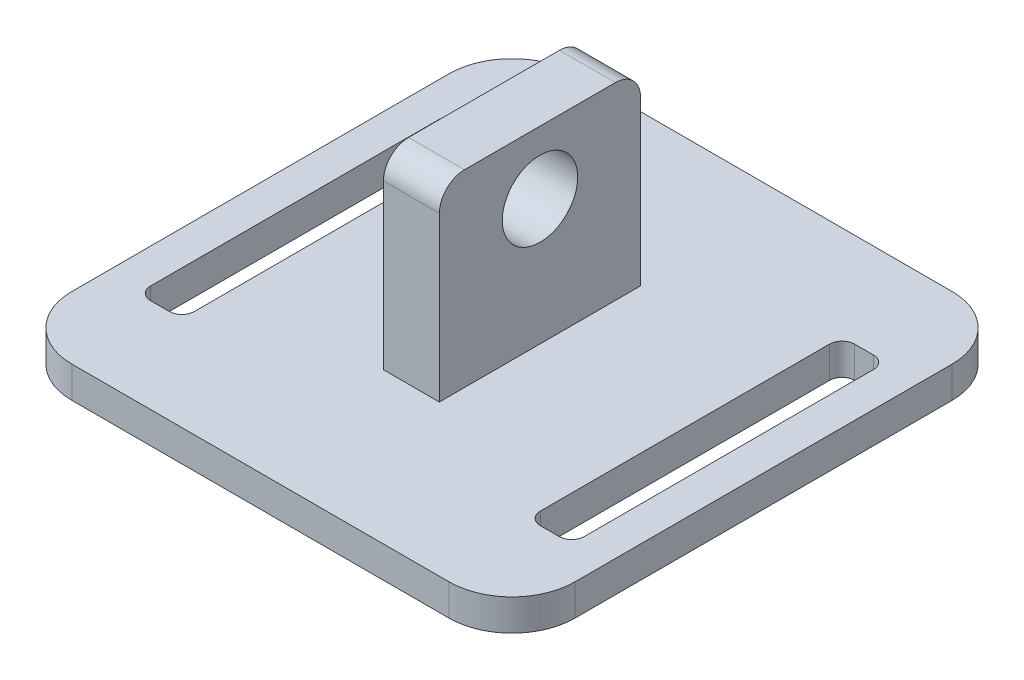
ISO-10303-21;
HEADER;
FILE_DESCRIPTION(('STEP AP214'),'2;1');
FILE_NAME('part.step','',(''),(''),'','','');
FILE_SCHEMA(('AUTOMOTIVE_DESIGN { 1 0 10303 214 1 1 1 1 }'));
ENDSEC;
DATA;
#1=APPLICATION_CONTEXT('core data for automotive mechanical design processes');
#2=APPLICATION_PROTOCOL_DEFINITION('international standard','automotive_design',2000,#1);
#3=PRODUCT_CONTEXT('',#1,'mechanical');
#4=PRODUCT('Part','Part','',(#3));
#5=PRODUCT_RELATED_PRODUCT_CATEGORY('part','',(#4));
#6=PRODUCT_DEFINITION_FORMATION('','',#4);
#7=PRODUCT_DEFINITION_CONTEXT('part definition',#1,'design');
#8=PRODUCT_DEFINITION('design','',#6,#7);
#9=PRODUCT_DEFINITION_SHAPE('','',#8);
#10=(LENGTH_UNIT() NAMED_UNIT(*) SI_UNIT(.MILLI.,.METRE.));
#11=(NAMED_UNIT(*) PLANE_ANGLE_UNIT() SI_UNIT($,.RADIAN.));
#12=(NAMED_UNIT(*) SI_UNIT($,.STERADIAN.) SOLID_ANGLE_UNIT());
#13=UNCERTAINTY_MEASURE_WITH_UNIT(LENGTH_MEASURE(1.E-05),#10,'distance_accuracy_value','');
#14=(GEOMETRIC_REPRESENTATION_CONTEXT(3) GLOBAL_UNCERTAINTY_ASSIGNED_CONTEXT((#13)) GLOBAL_UNIT_ASSIGNED_CONTEXT((#10,
#11,#12)) REPRESENTATION_CONTEXT('',''));
#15=CARTESIAN_POINT('',(0.,0.,0.));
#16=DIRECTION('',(0.,0.,1.));
#17=DIRECTION('',(1.,0.,0.));
#18=AXIS2_PLACEMENT_3D('',#15,#16,#17);
#19=CARTESIAN_POINT('',(-15.,2.5,15.));
#20=DIRECTION('',(0.,-1.,0.));
#21=DIRECTION('',(0.,0.,-1.));
#22=AXIS2_PLACEMENT_3D('',#19,#20,#21);
#23=PLANE('',#22);
#24=DIRECTION('',(0.,0.,1.));
#25=VECTOR('',#24,1.);
#26=CARTESIAN_POINT('',(13.75,2.5,-12.5));
#27=LINE('',#26,#25);
#28=CARTESIAN_POINT('',(13.75,2.5,-11.5));
#29=VERTEX_POINT('',#28);
#30=CARTESIAN_POINT('',(13.75,2.5,11.5));
#31=VERTEX_POINT('',#30);
#32=EDGE_CURVE('E270',#29,#31,#27,.T.);
#33=ORIENTED_EDGE('',*,*,#32,.F.);
#34=CARTESIAN_POINT('',(14.75,2.5,-11.5));
#35=DIRECTION('',(0.,-1.,0.));
#36=DIRECTION('',(0.,0.,-1.));
#37=AXIS2_PLACEMENT_3D('',#34,#35,#36);
#38=CIRCLE('',#37,1.);
#39=CARTESIAN_POINT('',(14.75,2.5,-12.5));
#40=VERTEX_POINT('',#39);
#41=EDGE_CURVE('E437',#29,#40,#38,.T.);
#42=ORIENTED_EDGE('',*,*,#41,.T.);
#43=DIRECTION('',(-1.,0.,0.));
#44=VECTOR('',#43,1.);
#45=CARTESIAN_POINT('',(13.75,2.5,-12.5));
#46=LINE('',#45,#44);
#47=CARTESIAN_POINT('',(16.25,2.5,-12.5));
#48=VERTEX_POINT('',#47);
#49=EDGE_CURVE('E280',#48,#40,#46,.T.);
#50=ORIENTED_EDGE('',*,*,#49,.F.);
#51=CARTESIAN_POINT('',(16.25,2.5,-11.5));
#52=DIRECTION('',(0.,-1.,0.));
#53=DIRECTION('',(0.,0.,-1.));
#54=AXIS2_PLACEMENT_3D('',#51,#52,#53);
#55=CIRCLE('',#54,1.);
#56=CARTESIAN_POINT('',(17.25,2.5,-11.5));
#57=VERTEX_POINT('',#56);
#58=EDGE_CURVE('E433',#48,#57,#55,.T.);
#59=ORIENTED_EDGE('',*,*,#58,.T.);
#60=DIRECTION('',(0.,0.,-1.));
#61=VECTOR('',#60,1.);
#62=CARTESIAN_POINT('',(17.25,2.5,-12.5));
#63=LINE('',#62,#61);
#64=CARTESIAN_POINT('',(17.25,2.5,11.5));
#65=VERTEX_POINT('',#64);
#66=EDGE_CURVE('E277',#65,#57,#63,.T.);
#67=ORIENTED_EDGE('',*,*,#66,.F.);
#68=CARTESIAN_POINT('',(16.25,2.5,11.5));
#69=DIRECTION('',(0.,-1.,0.));
#70=DIRECTION('',(0.,0.,-1.));
#71=AXIS2_PLACEMENT_3D('',#68,#69,#70);
#72=CIRCLE('',#71,1.);
#73=CARTESIAN_POINT('',(16.25,2.5,12.5));
#74=VERTEX_POINT('',#73);
#75=EDGE_CURVE('E441',#65,#74,#72,.T.);
#76=ORIENTED_EDGE('',*,*,#75,.T.);
#77=DIRECTION('',(1.,0.,0.));
#78=VECTOR('',#77,1.);
#79=CARTESIAN_POINT('',(13.75,2.5,12.5));
#80=LINE('',#79,#78);
#81=CARTESIAN_POINT('',(14.75,2.5,12.5));
#82=VERTEX_POINT('',#81);
#83=EDGE_CURVE('E273',#82,#74,#80,.T.);
#84=ORIENTED_EDGE('',*,*,#83,.F.);
#85=CARTESIAN_POINT('',(14.75,2.5,11.5));
#86=DIRECTION('',(0.,-1.,0.));
#87=DIRECTION('',(0.,0.,-1.));
#88=AXIS2_PLACEMENT_3D('',#85,#86,#87);
#89=CIRCLE('',#88,1.);
#90=EDGE_CURVE('E445',#82,#31,#89,.T.);
#91=ORIENTED_EDGE('',*,*,#90,.T.);
#92=EDGE_LOOP('',(#33,#42,#50,#59,#67,#76,#84,#91));
#93=FACE_BOUND('',#92,.T.);
#94=CARTESIAN_POINT('',(-15.,2.5,15.));
#95=DIRECTION('',(0.,1.,0.));
#96=DIRECTION('',(0.,0.,-1.));
#97=AXIS2_PLACEMENT_3D('',#94,#95,#96);
#98=CIRCLE('',#97,5.);
#99=CARTESIAN_POINT('',(-20.,2.5,15.));
#100=VERTEX_POINT('',#99);
#101=CARTESIAN_POINT('',(-15.,2.5,20.));
#102=VERTEX_POINT('',#101);
#103=EDGE_CURVE('E318',#100,#102,#98,.T.);
#104=ORIENTED_EDGE('',*,*,#103,.T.);
#105=DIRECTION('',(1.,0.,0.));
#106=VECTOR('',#105,1.);
#107=CARTESIAN_POINT('',(15.,2.5,20.));
#108=LINE('',#107,#106);
#109=CARTESIAN_POINT('',(15.,2.5,20.));
#110=VERTEX_POINT('',#109);
#111=EDGE_CURVE('E321',#102,#110,#108,.T.);
#112=ORIENTED_EDGE('',*,*,#111,.T.);
#113=CARTESIAN_POINT('',(15.,2.5,15.));
#114=DIRECTION('',(0.,1.,0.));
#115=DIRECTION('',(0.,0.,-1.));
#116=AXIS2_PLACEMENT_3D('',#113,#114,#115);
#117=CIRCLE('',#116,5.);
#118=CARTESIAN_POINT('',(20.,2.5,15.));
#119=VERTEX_POINT('',#118);
#120=EDGE_CURVE('E324',#110,#119,#117,.T.);
#121=ORIENTED_EDGE('',*,*,#120,.T.);
#122=DIRECTION('',(0.,0.,-1.));
#123=VECTOR('',#122,1.);
#124=CARTESIAN_POINT('',(20.,2.5,-15.));
#125=LINE('',#124,#123);
#126=CARTESIAN_POINT('',(20.,2.5,-15.));
#127=VERTEX_POINT('',#126);
#128=EDGE_CURVE('E326',#119,#127,#125,.T.);
#129=ORIENTED_EDGE('',*,*,#128,.T.);
#130=CARTESIAN_POINT('',(15.,2.5,-15.));
#131=DIRECTION('',(0.,1.,0.));
#132=DIRECTION('',(0.,0.,-1.));
#133=AXIS2_PLACEMENT_3D('',#130,#131,#132);
#134=CIRCLE('',#133,5.);
#135=CARTESIAN_POINT('',(15.,2.5,-20.));
#136=VERTEX_POINT('',#135);
#137=EDGE_CURVE('E328',#127,#136,#134,.T.);
#138=ORIENTED_EDGE('',*,*,#137,.T.);
#139=DIRECTION('',(-1.,0.,0.));
#140=VECTOR('',#139,1.);
#141=CARTESIAN_POINT('',(15.,2.5,-20.));
#142=LINE('',#141,#140);
#143=CARTESIAN_POINT('',(-15.,2.5,-20.));
#144=VERTEX_POINT('',#143);
#145=EDGE_CURVE('E330',#136,#144,#142,.T.);
#146=ORIENTED_EDGE('',*,*,#145,.T.);
#147=CARTESIAN_POINT('',(-15.,2.5,-15.));
#148=DIRECTION('',(0.,1.,0.));
#149=DIRECTION('',(0.,0.,1.));
#150=AXIS2_PLACEMENT_3D('',#147,#148,#149);
#151=CIRCLE('',#150,5.);
#152=CARTESIAN_POINT('',(-20.,2.5,-15.));
#153=VERTEX_POINT('',#152);
#154=EDGE_CURVE('E332',#144,#153,#151,.T.);
#155=ORIENTED_EDGE('',*,*,#154,.T.);
#156=DIRECTION('',(0.,0.,1.));
#157=VECTOR('',#156,1.);
#158=CARTESIAN_POINT('',(-20.,2.5,-15.));
#159=LINE('',#158,#157);
#160=EDGE_CURVE('E334',#153,#100,#159,.T.);
#161=ORIENTED_EDGE('',*,*,#160,.T.);
#162=EDGE_LOOP('',(#104,#112,#121,#129,#138,#146,#155,#161));
#163=FACE_BOUND('',#162,.T.);
#164=DIRECTION('',(0.,0.,1.));
#165=VECTOR('',#164,1.);
#166=CARTESIAN_POINT('',(-17.25,2.5,-12.5));
#167=LINE('',#166,#165);
#168=CARTESIAN_POINT('',(-17.25,2.5,-11.5));
#169=VERTEX_POINT('',#168);
#170=CARTESIAN_POINT('',(-17.25,2.5,11.5));
#171=VERTEX_POINT('',#170);
#172=EDGE_CURVE('E294',#169,#171,#167,.T.);
#173=ORIENTED_EDGE('',*,*,#172,.F.);
#174=CARTESIAN_POINT('',(-16.25,2.5,-11.5));
#175=DIRECTION('',(0.,-1.,0.));
#176=DIRECTION('',(0.,0.,-1.));
#177=AXIS2_PLACEMENT_3D('',#174,#175,#176);
#178=CIRCLE('',#177,1.);
#179=CARTESIAN_POINT('',(-16.25,2.5,-12.5));
#180=VERTEX_POINT('',#179);
#181=EDGE_CURVE('E409',#169,#180,#178,.T.);
#182=ORIENTED_EDGE('',*,*,#181,.T.);
#183=DIRECTION('',(-1.,0.,0.));
#184=VECTOR('',#183,1.);
#185=CARTESIAN_POINT('',(-13.75,2.5,-12.5));
#186=LINE('',#185,#184);
#187=CARTESIAN_POINT('',(-14.75,2.5,-12.5));
#188=VERTEX_POINT('',#187);
#189=EDGE_CURVE('E304',#188,#180,#186,.T.);
#190=ORIENTED_EDGE('',*,*,#189,.F.);
#191=CARTESIAN_POINT('',(-14.75,2.5,-11.5));
#192=DIRECTION('',(0.,-1.,0.));
#193=DIRECTION('',(0.,0.,-1.));
#194=AXIS2_PLACEMENT_3D('',#191,#192,#193);
#195=CIRCLE('',#194,1.);
#196=CARTESIAN_POINT('',(-13.75,2.5,-11.5));
#197=VERTEX_POINT('',#196);
#198=EDGE_CURVE('E405',#188,#197,#195,.T.);
#199=ORIENTED_EDGE('',*,*,#198,.T.);
#200=DIRECTION('',(0.,0.,-1.));
#201=VECTOR('',#200,1.);
#202=CARTESIAN_POINT('',(-13.75,2.5,-12.5));
#203=LINE('',#202,#201);
#204=CARTESIAN_POINT('',(-13.75,2.5,11.5));
#205=VERTEX_POINT('',#204);
#206=EDGE_CURVE('E301',#205,#197,#203,.T.);
#207=ORIENTED_EDGE('',*,*,#206,.F.);
#208=CARTESIAN_POINT('',(-14.75,2.5,11.5));
#209=DIRECTION('',(0.,-1.,0.));
#210=DIRECTION('',(0.,0.,-1.));
#211=AXIS2_PLACEMENT_3D('',#208,#209,#210);
#212=CIRCLE('',#211,1.);
#213=CARTESIAN_POINT('',(-14.75,2.5,12.5));
#214=VERTEX_POINT('',#213);
#215=EDGE_CURVE('E397',#205,#214,#212,.T.);
#216=ORIENTED_EDGE('',*,*,#215,.T.);
#217=DIRECTION('',(1.,0.,0.));
#218=VECTOR('',#217,1.);
#219=CARTESIAN_POINT('',(-13.75,2.5,12.5));
#220=LINE('',#219,#218);
#221=CARTESIAN_POINT('',(-16.25,2.5,12.5));
#222=VERTEX_POINT('',#221);
#223=EDGE_CURVE('E297',#222,#214,#220,.T.);
#224=ORIENTED_EDGE('',*,*,#223,.F.);
#225=CARTESIAN_POINT('',(-16.25,2.5,11.5));
#226=DIRECTION('',(0.,-1.,0.));
#227=DIRECTION('',(0.,0.,-1.));
#228=AXIS2_PLACEMENT_3D('',#225,#226,#227);
#229=CIRCLE('',#228,1.);
#230=EDGE_CURVE('E401',#222,#171,#229,.T.);
#231=ORIENTED_EDGE('',*,*,#230,.T.);
#232=EDGE_LOOP('',(#173,#182,#190,#199,#207,#216,#224,#231));
#233=FACE_BOUND('',#232,.T.);
#234=DIRECTION('',(0.,0.,1.));
#235=VECTOR('',#234,1.);
#236=CARTESIAN_POINT('',(-2.225,2.5,-8.));
#237=LINE('',#236,#235);
#238=CARTESIAN_POINT('',(-2.225,2.5,-8.));
#239=VERTEX_POINT('',#238);
#240=CARTESIAN_POINT('',(-2.225,2.5,8.));
#241=VERTEX_POINT('',#240);
#242=EDGE_CURVE('E237',#239,#241,#237,.T.);
#243=ORIENTED_EDGE('',*,*,#242,.F.);
#244=DIRECTION('',(-1.,0.,0.));
#245=VECTOR('',#244,1.);
#246=CARTESIAN_POINT('',(2.225,2.5,-8.));
#247=LINE('',#246,#245);
#248=CARTESIAN_POINT('',(2.225,2.5,-8.));
#249=VERTEX_POINT('',#248);
#250=EDGE_CURVE('E248',#249,#239,#247,.T.);
#251=ORIENTED_EDGE('',*,*,#250,.F.);
#252=DIRECTION('',(0.,0.,-1.));
#253=VECTOR('',#252,1.);
#254=CARTESIAN_POINT('',(2.225,2.5,-8.));
#255=LINE('',#254,#253);
#256=CARTESIAN_POINT('',(2.225,2.5,8.));
#257=VERTEX_POINT('',#256);
#258=EDGE_CURVE('E257',#257,#249,#255,.T.);
#259=ORIENTED_EDGE('',*,*,#258,.F.);
#260=DIRECTION('',(1.,0.,0.));
#261=VECTOR('',#260,1.);
#262=CARTESIAN_POINT('',(2.225,2.5,8.));
#263=LINE('',#262,#261);
#264=EDGE_CURVE('E251',#241,#257,#263,.T.);
#265=ORIENTED_EDGE('',*,*,#264,.F.);
#266=EDGE_LOOP('',(#243,#251,#259,#265));
#267=FACE_BOUND('',#266,.T.);
#268=ADVANCED_FACE('F39',(#93,#163,#233,#267),#23,.F.);
#269=CARTESIAN_POINT('',(-15.,0.,15.));
#270=DIRECTION('',(0.,-1.,0.));
#271=DIRECTION('',(0.,0.,-1.));
#272=AXIS2_PLACEMENT_3D('',#269,#270,#271);
#273=PLANE('',#272);
#274=CARTESIAN_POINT('',(-15.,0.,15.));
#275=DIRECTION('',(0.,1.,0.));
#276=DIRECTION('',(0.,0.,-1.));
#277=AXIS2_PLACEMENT_3D('',#274,#275,#276);
#278=CIRCLE('',#277,5.);
#279=CARTESIAN_POINT('',(-20.,0.,15.));
#280=VERTEX_POINT('',#279);
#281=CARTESIAN_POINT('',(-15.,0.,20.));
#282=VERTEX_POINT('',#281);
#283=EDGE_CURVE('E307',#280,#282,#278,.T.);
#284=ORIENTED_EDGE('',*,*,#283,.F.);
#285=DIRECTION('',(0.,0.,1.));
#286=VECTOR('',#285,1.);
#287=CARTESIAN_POINT('',(-20.,0.,-15.));
#288=LINE('',#287,#286);
#289=CARTESIAN_POINT('',(-20.,0.,-15.));
#290=VERTEX_POINT('',#289);
#291=EDGE_CURVE('E322',#290,#280,#288,.T.);
#292=ORIENTED_EDGE('',*,*,#291,.F.);
#293=CARTESIAN_POINT('',(-15.,0.,-15.));
#294=DIRECTION('',(0.,1.,0.));
#295=DIRECTION('',(0.,0.,1.));
#296=AXIS2_PLACEMENT_3D('',#293,#294,#295);
#297=CIRCLE('',#296,5.);
#298=CARTESIAN_POINT('',(-15.,0.,-20.));
#299=VERTEX_POINT('',#298);
#300=EDGE_CURVE('E349',#299,#290,#297,.T.);
#301=ORIENTED_EDGE('',*,*,#300,.F.);
#302=DIRECTION('',(-1.,0.,0.));
#303=VECTOR('',#302,1.);
#304=CARTESIAN_POINT('',(15.,0.,-20.));
#305=LINE('',#304,#303);
#306=CARTESIAN_POINT('',(15.,0.,-20.));
#307=VERTEX_POINT('',#306);
#308=EDGE_CURVE('E347',#307,#299,#305,.T.);
#309=ORIENTED_EDGE('',*,*,#308,.F.);
#310=CARTESIAN_POINT('',(15.,0.,-15.));
#311=DIRECTION('',(0.,1.,0.));
#312=DIRECTION('',(0.,0.,-1.));
#313=AXIS2_PLACEMENT_3D('',#310,#311,#312);
#314=CIRCLE('',#313,5.);
#315=CARTESIAN_POINT('',(20.,0.,-15.));
#316=VERTEX_POINT('',#315);
#317=EDGE_CURVE('E345',#316,#307,#314,.T.);
#318=ORIENTED_EDGE('',*,*,#317,.F.);
#319=DIRECTION('',(0.,0.,-1.));
#320=VECTOR('',#319,1.);
#321=CARTESIAN_POINT('',(20.,0.,-15.));
#322=LINE('',#321,#320);
#323=CARTESIAN_POINT('',(20.,0.,15.));
#324=VERTEX_POINT('',#323);
#325=EDGE_CURVE('E343',#324,#316,#322,.T.);
#326=ORIENTED_EDGE('',*,*,#325,.F.);
#327=CARTESIAN_POINT('',(15.,0.,15.));
#328=DIRECTION('',(0.,1.,0.));
#329=DIRECTION('',(0.,0.,-1.));
#330=AXIS2_PLACEMENT_3D('',#327,#328,#329);
#331=CIRCLE('',#330,5.);
#332=CARTESIAN_POINT('',(15.,0.,20.));
#333=VERTEX_POINT('',#332);
#334=EDGE_CURVE('E341',#333,#324,#331,.T.);
#335=ORIENTED_EDGE('',*,*,#334,.F.);
#336=DIRECTION('',(1.,0.,0.));
#337=VECTOR('',#336,1.);
#338=CARTESIAN_POINT('',(15.,0.,20.));
#339=LINE('',#338,#337);
#340=EDGE_CURVE('E339',#282,#333,#339,.T.);
#341=ORIENTED_EDGE('',*,*,#340,.F.);
#342=EDGE_LOOP('',(#284,#292,#301,#309,#318,#326,#335,#341));
#343=FACE_BOUND('',#342,.T.);
#344=DIRECTION('',(0.,0.,-1.));
#345=VECTOR('',#344,1.);
#346=CARTESIAN_POINT('',(-13.75,0.,-12.5));
#347=LINE('',#346,#345);
#348=CARTESIAN_POINT('',(-13.75,0.,11.5));
#349=VERTEX_POINT('',#348);
#350=CARTESIAN_POINT('',(-13.75,0.,-11.5));
#351=VERTEX_POINT('',#350);
#352=EDGE_CURVE('E313',#349,#351,#347,.T.);
#353=ORIENTED_EDGE('',*,*,#352,.T.);
#354=CARTESIAN_POINT('',(-14.75,0.,-11.5));
#355=DIRECTION('',(0.,-1.,0.));
#356=DIRECTION('',(0.,0.,-1.));
#357=AXIS2_PLACEMENT_3D('',#354,#355,#356);
#358=CIRCLE('',#357,1.);
#359=CARTESIAN_POINT('',(-14.75,0.,-12.5));
#360=VERTEX_POINT('',#359);
#361=EDGE_CURVE('E403',#351,#360,#358,.F.);
#362=ORIENTED_EDGE('',*,*,#361,.T.);
#363=DIRECTION('',(-1.,0.,0.));
#364=VECTOR('',#363,1.);
#365=CARTESIAN_POINT('',(-13.75,0.,-12.5));
#366=LINE('',#365,#364);
#367=CARTESIAN_POINT('',(-16.25,0.,-12.5));
#368=VERTEX_POINT('',#367);
#369=EDGE_CURVE('E298',#360,#368,#366,.T.);
#370=ORIENTED_EDGE('',*,*,#369,.T.);
#371=CARTESIAN_POINT('',(-16.25,0.,-11.5));
#372=DIRECTION('',(0.,-1.,0.));
#373=DIRECTION('',(0.,0.,-1.));
#374=AXIS2_PLACEMENT_3D('',#371,#372,#373);
#375=CIRCLE('',#374,1.);
#376=CARTESIAN_POINT('',(-17.25,0.,-11.5));
#377=VERTEX_POINT('',#376);
#378=EDGE_CURVE('E407',#368,#377,#375,.F.);
#379=ORIENTED_EDGE('',*,*,#378,.T.);
#380=DIRECTION('',(0.,0.,1.));
#381=VECTOR('',#380,1.);
#382=CARTESIAN_POINT('',(-17.25,0.,-12.5));
#383=LINE('',#382,#381);
#384=CARTESIAN_POINT('',(-17.25,0.,11.5));
#385=VERTEX_POINT('',#384);
#386=EDGE_CURVE('E283',#377,#385,#383,.T.);
#387=ORIENTED_EDGE('',*,*,#386,.T.);
#388=CARTESIAN_POINT('',(-16.25,0.,11.5));
#389=DIRECTION('',(0.,-1.,0.));
#390=DIRECTION('',(0.,0.,-1.));
#391=AXIS2_PLACEMENT_3D('',#388,#389,#390);
#392=CIRCLE('',#391,1.);
#393=CARTESIAN_POINT('',(-16.25,0.,12.5));
#394=VERTEX_POINT('',#393);
#395=EDGE_CURVE('E399',#385,#394,#392,.F.);
#396=ORIENTED_EDGE('',*,*,#395,.T.);
#397=DIRECTION('',(1.,0.,0.));
#398=VECTOR('',#397,1.);
#399=CARTESIAN_POINT('',(-13.75,0.,12.5));
#400=LINE('',#399,#398);
#401=CARTESIAN_POINT('',(-14.75,0.,12.5));
#402=VERTEX_POINT('',#401);
#403=EDGE_CURVE('E310',#394,#402,#400,.T.);
#404=ORIENTED_EDGE('',*,*,#403,.T.);
#405=CARTESIAN_POINT('',(-14.75,0.,11.5));
#406=DIRECTION('',(0.,-1.,0.));
#407=DIRECTION('',(0.,0.,-1.));
#408=AXIS2_PLACEMENT_3D('',#405,#406,#407);
#409=CIRCLE('',#408,1.);
#410=EDGE_CURVE('E395',#402,#349,#409,.F.);
#411=ORIENTED_EDGE('',*,*,#410,.T.);
#412=EDGE_LOOP('',(#353,#362,#370,#379,#387,#396,#404,#411));
#413=FACE_BOUND('',#412,.T.);
#414=DIRECTION('',(0.,0.,-1.));
#415=VECTOR('',#414,1.);
#416=CARTESIAN_POINT('',(17.25,0.,-12.5));
#417=LINE('',#416,#415);
#418=CARTESIAN_POINT('',(17.25,0.,11.5));
#419=VERTEX_POINT('',#418);
#420=CARTESIAN_POINT('',(17.25,0.,-11.5));
#421=VERTEX_POINT('',#420);
#422=EDGE_CURVE('E289',#419,#421,#417,.T.);
#423=ORIENTED_EDGE('',*,*,#422,.T.);
#424=CARTESIAN_POINT('',(16.25,0.,-11.5));
#425=DIRECTION('',(0.,-1.,0.));
#426=DIRECTION('',(0.,0.,-1.));
#427=AXIS2_PLACEMENT_3D('',#424,#425,#426);
#428=CIRCLE('',#427,1.);
#429=CARTESIAN_POINT('',(16.25,0.,-12.5));
#430=VERTEX_POINT('',#429);
#431=EDGE_CURVE('E431',#421,#430,#428,.F.);
#432=ORIENTED_EDGE('',*,*,#431,.T.);
#433=DIRECTION('',(-1.,0.,0.));
#434=VECTOR('',#433,1.);
#435=CARTESIAN_POINT('',(13.75,0.,-12.5));
#436=LINE('',#435,#434);
#437=CARTESIAN_POINT('',(14.75,0.,-12.5));
#438=VERTEX_POINT('',#437);
#439=EDGE_CURVE('E274',#430,#438,#436,.T.);
#440=ORIENTED_EDGE('',*,*,#439,.T.);
#441=CARTESIAN_POINT('',(14.75,0.,-11.5));
#442=DIRECTION('',(0.,-1.,0.));
#443=DIRECTION('',(0.,0.,-1.));
#444=AXIS2_PLACEMENT_3D('',#441,#442,#443);
#445=CIRCLE('',#444,1.);
#446=CARTESIAN_POINT('',(13.75,0.,-11.5));
#447=VERTEX_POINT('',#446);
#448=EDGE_CURVE('E435',#438,#447,#445,.F.);
#449=ORIENTED_EDGE('',*,*,#448,.T.);
#450=DIRECTION('',(0.,0.,1.));
#451=VECTOR('',#450,1.);
#452=CARTESIAN_POINT('',(13.75,0.,-12.5));
#453=LINE('',#452,#451);
#454=CARTESIAN_POINT('',(13.75,0.,11.5));
#455=VERTEX_POINT('',#454);
#456=EDGE_CURVE('E269',#447,#455,#453,.T.);
#457=ORIENTED_EDGE('',*,*,#456,.T.);
#458=CARTESIAN_POINT('',(14.75,0.,11.5));
#459=DIRECTION('',(0.,-1.,0.));
#460=DIRECTION('',(0.,0.,-1.));
#461=AXIS2_PLACEMENT_3D('',#458,#459,#460);
#462=CIRCLE('',#461,1.);
#463=CARTESIAN_POINT('',(14.75,0.,12.5));
#464=VERTEX_POINT('',#463);
#465=EDGE_CURVE('E443',#455,#464,#462,.F.);
#466=ORIENTED_EDGE('',*,*,#465,.T.);
#467=DIRECTION('',(1.,0.,0.));
#468=VECTOR('',#467,1.);
#469=CARTESIAN_POINT('',(13.75,0.,12.5));
#470=LINE('',#469,#468);
#471=CARTESIAN_POINT('',(16.25,0.,12.5));
#472=VERTEX_POINT('',#471);
#473=EDGE_CURVE('E286',#464,#472,#470,.T.);
#474=ORIENTED_EDGE('',*,*,#473,.T.);
#475=CARTESIAN_POINT('',(16.25,0.,11.5));
#476=DIRECTION('',(0.,-1.,0.));
#477=DIRECTION('',(0.,0.,-1.));
#478=AXIS2_PLACEMENT_3D('',#475,#476,#477);
#479=CIRCLE('',#478,1.);
#480=EDGE_CURVE('E439',#472,#419,#479,.F.);
#481=ORIENTED_EDGE('',*,*,#480,.T.);
#482=EDGE_LOOP('',(#423,#432,#440,#449,#457,#466,#474,#481));
#483=FACE_BOUND('',#482,.T.);
#484=ADVANCED_FACE('F491',(#343,#413,#483),#273,.T.);
#485=CARTESIAN_POINT('',(-15.,2.5,15.));
#486=DIRECTION('',(0.,-1.,0.));
#487=DIRECTION('',(0.,0.,-1.));
#488=AXIS2_PLACEMENT_3D('',#485,#486,#487);
#489=CYLINDRICAL_SURFACE('',#488,5.);
#490=ORIENTED_EDGE('',*,*,#283,.T.);
#491=DIRECTION('',(0.,-1.,0.));
#492=VECTOR('',#491,1.);
#493=CARTESIAN_POINT('',(-15.,2.5,20.));
#494=LINE('',#493,#492);
#495=EDGE_CURVE('E372',#102,#282,#494,.T.);
#496=ORIENTED_EDGE('',*,*,#495,.F.);
#497=ORIENTED_EDGE('',*,*,#103,.F.);
#498=DIRECTION('',(0.,-1.,0.));
#499=VECTOR('',#498,1.);
#500=CARTESIAN_POINT('',(-20.,2.5,15.));
#501=LINE('',#500,#499);
#502=EDGE_CURVE('E336',#100,#280,#501,.T.);
#503=ORIENTED_EDGE('',*,*,#502,.T.);
#504=EDGE_LOOP('',(#490,#496,#497,#503));
#505=FACE_BOUND('',#504,.T.);
#506=ADVANCED_FACE('F498',(#505),#489,.T.);
#507=CARTESIAN_POINT('',(15.,2.5,20.));
#508=DIRECTION('',(0.,0.,-1.));
#509=DIRECTION('',(-1.,0.,0.));
#510=AXIS2_PLACEMENT_3D('',#507,#508,#509);
#511=PLANE('',#510);
#512=ORIENTED_EDGE('',*,*,#340,.T.);
#513=DIRECTION('',(0.,-1.,0.));
#514=VECTOR('',#513,1.);
#515=CARTESIAN_POINT('',(15.,2.5,20.));
#516=LINE('',#515,#514);
#517=EDGE_CURVE('E369',#110,#333,#516,.T.);
#518=ORIENTED_EDGE('',*,*,#517,.F.);
#519=ORIENTED_EDGE('',*,*,#111,.F.);
#520=ORIENTED_EDGE('',*,*,#495,.T.);
#521=EDGE_LOOP('',(#512,#518,#519,#520));
#522=FACE_BOUND('',#521,.T.);
#523=ADVANCED_FACE('F530',(#522),#511,.F.);
#524=CARTESIAN_POINT('',(15.,2.5,15.));
#525=DIRECTION('',(0.,-1.,0.));
#526=DIRECTION('',(0.,0.,-1.));
#527=AXIS2_PLACEMENT_3D('',#524,#525,#526);
#528=CYLINDRICAL_SURFACE('',#527,5.);
#529=ORIENTED_EDGE('',*,*,#334,.T.);
#530=DIRECTION('',(0.,-1.,0.));
#531=VECTOR('',#530,1.);
#532=CARTESIAN_POINT('',(20.,2.5,15.));
#533=LINE('',#532,#531);
#534=EDGE_CURVE('E366',#119,#324,#533,.T.);
#535=ORIENTED_EDGE('',*,*,#534,.F.);
#536=ORIENTED_EDGE('',*,*,#120,.F.);
#537=ORIENTED_EDGE('',*,*,#517,.T.);
#538=EDGE_LOOP('',(#529,#535,#536,#537));
#539=FACE_BOUND('',#538,.T.);
#540=ADVANCED_FACE('F526',(#539),#528,.T.);
#541=CARTESIAN_POINT('',(20.,2.5,-15.));
#542=DIRECTION('',(-1.,0.,0.));
#543=DIRECTION('',(0.,0.,1.));
#544=AXIS2_PLACEMENT_3D('',#541,#542,#543);
#545=PLANE('',#544);
#546=ORIENTED_EDGE('',*,*,#325,.T.);
#547=DIRECTION('',(0.,-1.,0.));
#548=VECTOR('',#547,1.);
#549=CARTESIAN_POINT('',(20.,2.5,-15.));
#550=LINE('',#549,#548);
#551=EDGE_CURVE('E363',#127,#316,#550,.T.);
#552=ORIENTED_EDGE('',*,*,#551,.F.);
#553=ORIENTED_EDGE('',*,*,#128,.F.);
#554=ORIENTED_EDGE('',*,*,#534,.T.);
#555=EDGE_LOOP('',(#546,#552,#553,#554));
#556=FACE_BOUND('',#555,.T.);
#557=ADVANCED_FACE('F522',(#556),#545,.F.);
#558=CARTESIAN_POINT('',(15.,2.5,-15.));
#559=DIRECTION('',(0.,-1.,0.));
#560=DIRECTION('',(0.,0.,-1.));
#561=AXIS2_PLACEMENT_3D('',#558,#559,#560);
#562=CYLINDRICAL_SURFACE('',#561,5.);
#563=ORIENTED_EDGE('',*,*,#317,.T.);
#564=DIRECTION('',(0.,-1.,0.));
#565=VECTOR('',#564,1.);
#566=CARTESIAN_POINT('',(15.,2.5,-20.));
#567=LINE('',#566,#565);
#568=EDGE_CURVE('E360',#136,#307,#567,.T.);
#569=ORIENTED_EDGE('',*,*,#568,.F.);
#570=ORIENTED_EDGE('',*,*,#137,.F.);
#571=ORIENTED_EDGE('',*,*,#551,.T.);
#572=EDGE_LOOP('',(#563,#569,#570,#571));
#573=FACE_BOUND('',#572,.T.);
#574=ADVANCED_FACE('F518',(#573),#562,.T.);
#575=CARTESIAN_POINT('',(15.,2.5,-20.));
#576=DIRECTION('',(0.,0.,1.));
#577=DIRECTION('',(1.,0.,0.));
#578=AXIS2_PLACEMENT_3D('',#575,#576,#577);
#579=PLANE('',#578);
#580=ORIENTED_EDGE('',*,*,#308,.T.);
#581=DIRECTION('',(0.,-1.,0.));
#582=VECTOR('',#581,1.);
#583=CARTESIAN_POINT('',(-15.,2.5,-20.));
#584=LINE('',#583,#582);
#585=EDGE_CURVE('E357',#144,#299,#584,.T.);
#586=ORIENTED_EDGE('',*,*,#585,.F.);
#587=ORIENTED_EDGE('',*,*,#145,.F.);
#588=ORIENTED_EDGE('',*,*,#568,.T.);
#589=EDGE_LOOP('',(#580,#586,#587,#588));
#590=FACE_BOUND('',#589,.T.);
#591=ADVANCED_FACE('F514',(#590),#579,.F.);
#592=CARTESIAN_POINT('',(-15.,2.5,-15.));
#593=DIRECTION('',(0.,-1.,0.));
#594=DIRECTION('',(0.,0.,-1.));
#595=AXIS2_PLACEMENT_3D('',#592,#593,#594);
#596=CYLINDRICAL_SURFACE('',#595,5.);
#597=ORIENTED_EDGE('',*,*,#300,.T.);
#598=DIRECTION('',(0.,-1.,0.));
#599=VECTOR('',#598,1.);
#600=CARTESIAN_POINT('',(-20.,2.5,-15.));
#601=LINE('',#600,#599);
#602=EDGE_CURVE('E354',#153,#290,#601,.T.);
#603=ORIENTED_EDGE('',*,*,#602,.F.);
#604=ORIENTED_EDGE('',*,*,#154,.F.);
#605=ORIENTED_EDGE('',*,*,#585,.T.);
#606=EDGE_LOOP('',(#597,#603,#604,#605));
#607=FACE_BOUND('',#606,.T.);
#608=ADVANCED_FACE('F510',(#607),#596,.T.);
#609=CARTESIAN_POINT('',(-20.,2.5,-15.));
#610=DIRECTION('',(1.,0.,0.));
#611=DIRECTION('',(0.,0.,-1.));
#612=AXIS2_PLACEMENT_3D('',#609,#610,#611);
#613=PLANE('',#612);
#614=ORIENTED_EDGE('',*,*,#291,.T.);
#615=ORIENTED_EDGE('',*,*,#502,.F.);
#616=ORIENTED_EDGE('',*,*,#160,.F.);
#617=ORIENTED_EDGE('',*,*,#602,.T.);
#618=EDGE_LOOP('',(#614,#615,#616,#617));
#619=FACE_BOUND('',#618,.T.);
#620=ADVANCED_FACE('F507',(#619),#613,.F.);
#621=CARTESIAN_POINT('',(-17.25,2.5,-12.5));
#622=DIRECTION('',(1.,0.,0.));
#623=DIRECTION('',(0.,0.,-1.));
#624=AXIS2_PLACEMENT_3D('',#621,#622,#623);
#625=PLANE('',#624);
#626=ORIENTED_EDGE('',*,*,#172,.T.);
#627=DIRECTION('',(0.,-1.,0.));
#628=VECTOR('',#627,1.);
#629=CARTESIAN_POINT('',(-17.25,0.,11.5));
#630=LINE('',#629,#628);
#631=EDGE_CURVE('E387',#171,#385,#630,.T.);
#632=ORIENTED_EDGE('',*,*,#631,.T.);
#633=ORIENTED_EDGE('',*,*,#386,.F.);
#634=DIRECTION('',(0.,-1.,0.));
#635=VECTOR('',#634,1.);
#636=CARTESIAN_POINT('',(-17.25,2.5,-11.5));
#637=LINE('',#636,#635);
#638=EDGE_CURVE('E385',#377,#169,#637,.F.);
#639=ORIENTED_EDGE('',*,*,#638,.T.);
#640=EDGE_LOOP('',(#626,#632,#633,#639));
#641=FACE_BOUND('',#640,.T.);
#642=ADVANCED_FACE('F504',(#641),#625,.T.);
#643=CARTESIAN_POINT('',(-13.75,2.5,12.5));
#644=DIRECTION('',(0.,0.,-1.));
#645=DIRECTION('',(-1.,0.,0.));
#646=AXIS2_PLACEMENT_3D('',#643,#644,#645);
#647=PLANE('',#646);
#648=ORIENTED_EDGE('',*,*,#223,.T.);
#649=DIRECTION('',(0.,-1.,0.));
#650=VECTOR('',#649,1.);
#651=CARTESIAN_POINT('',(-14.75,0.,12.5));
#652=LINE('',#651,#650);
#653=EDGE_CURVE('E377',#214,#402,#652,.T.);
#654=ORIENTED_EDGE('',*,*,#653,.T.);
#655=ORIENTED_EDGE('',*,*,#403,.F.);
#656=DIRECTION('',(0.,-1.,0.));
#657=VECTOR('',#656,1.);
#658=CARTESIAN_POINT('',(-16.25,2.5,12.5));
#659=LINE('',#658,#657);
#660=EDGE_CURVE('E375',#394,#222,#659,.F.);
#661=ORIENTED_EDGE('',*,*,#660,.T.);
#662=EDGE_LOOP('',(#648,#654,#655,#661));
#663=FACE_BOUND('',#662,.T.);
#664=ADVANCED_FACE('F615',(#663),#647,.T.);
#665=CARTESIAN_POINT('',(-13.75,2.5,-12.5));
#666=DIRECTION('',(-1.,0.,0.));
#667=DIRECTION('',(0.,0.,1.));
#668=AXIS2_PLACEMENT_3D('',#665,#666,#667);
#669=PLANE('',#668);
#670=ORIENTED_EDGE('',*,*,#352,.F.);
#671=DIRECTION('',(0.,-1.,0.));
#672=VECTOR('',#671,1.);
#673=CARTESIAN_POINT('',(-13.75,2.5,11.5));
#674=LINE('',#673,#672);
#675=EDGE_CURVE('E383',#349,#205,#674,.F.);
#676=ORIENTED_EDGE('',*,*,#675,.T.);
#677=ORIENTED_EDGE('',*,*,#206,.T.);
#678=DIRECTION('',(0.,-1.,0.));
#679=VECTOR('',#678,1.);
#680=CARTESIAN_POINT('',(-13.75,0.,-11.5));
#681=LINE('',#680,#679);
#682=EDGE_CURVE('E380',#197,#351,#681,.T.);
#683=ORIENTED_EDGE('',*,*,#682,.T.);
#684=EDGE_LOOP('',(#670,#676,#677,#683));
#685=FACE_BOUND('',#684,.T.);
#686=ADVANCED_FACE('F612',(#685),#669,.T.);
#687=CARTESIAN_POINT('',(-13.75,2.5,-12.5));
#688=DIRECTION('',(0.,0.,1.));
#689=DIRECTION('',(1.,0.,0.));
#690=AXIS2_PLACEMENT_3D('',#687,#688,#689);
#691=PLANE('',#690);
#692=ORIENTED_EDGE('',*,*,#369,.F.);
#693=DIRECTION('',(0.,-1.,0.));
#694=VECTOR('',#693,1.);
#695=CARTESIAN_POINT('',(-14.75,2.5,-12.5));
#696=LINE('',#695,#694);
#697=EDGE_CURVE('E393',#360,#188,#696,.F.);
#698=ORIENTED_EDGE('',*,*,#697,.T.);
#699=ORIENTED_EDGE('',*,*,#189,.T.);
#700=DIRECTION('',(0.,-1.,0.));
#701=VECTOR('',#700,1.);
#702=CARTESIAN_POINT('',(-16.25,0.,-12.5));
#703=LINE('',#702,#701);
#704=EDGE_CURVE('E390',#180,#368,#703,.T.);
#705=ORIENTED_EDGE('',*,*,#704,.T.);
#706=EDGE_LOOP('',(#692,#698,#699,#705));
#707=FACE_BOUND('',#706,.T.);
#708=ADVANCED_FACE('F606',(#707),#691,.T.);
#709=CARTESIAN_POINT('',(13.75,2.5,-12.5));
#710=DIRECTION('',(1.,0.,0.));
#711=DIRECTION('',(0.,0.,-1.));
#712=AXIS2_PLACEMENT_3D('',#709,#710,#711);
#713=PLANE('',#712);
#714=ORIENTED_EDGE('',*,*,#456,.F.);
#715=DIRECTION('',(0.,-1.,0.));
#716=VECTOR('',#715,1.);
#717=CARTESIAN_POINT('',(13.75,2.5,-11.5));
#718=LINE('',#717,#716);
#719=EDGE_CURVE('E424',#447,#29,#718,.F.);
#720=ORIENTED_EDGE('',*,*,#719,.T.);
#721=ORIENTED_EDGE('',*,*,#32,.T.);
#722=DIRECTION('',(0.,-1.,0.));
#723=VECTOR('',#722,1.);
#724=CARTESIAN_POINT('',(13.75,0.,11.5));
#725=LINE('',#724,#723);
#726=EDGE_CURVE('E421',#31,#455,#725,.T.);
#727=ORIENTED_EDGE('',*,*,#726,.T.);
#728=EDGE_LOOP('',(#714,#720,#721,#727));
#729=FACE_BOUND('',#728,.T.);
#730=ADVANCED_FACE('F579',(#729),#713,.T.);
#731=CARTESIAN_POINT('',(13.75,2.5,12.5));
#732=DIRECTION('',(0.,0.,-1.));
#733=DIRECTION('',(-1.,0.,0.));
#734=AXIS2_PLACEMENT_3D('',#731,#732,#733);
#735=PLANE('',#734);
#736=ORIENTED_EDGE('',*,*,#83,.T.);
#737=DIRECTION('',(0.,-1.,0.));
#738=VECTOR('',#737,1.);
#739=CARTESIAN_POINT('',(16.25,0.,12.5));
#740=LINE('',#739,#738);
#741=EDGE_CURVE('E428',#74,#472,#740,.T.);
#742=ORIENTED_EDGE('',*,*,#741,.T.);
#743=ORIENTED_EDGE('',*,*,#473,.F.);
#744=DIRECTION('',(0.,-1.,0.));
#745=VECTOR('',#744,1.);
#746=CARTESIAN_POINT('',(14.75,2.5,12.5));
#747=LINE('',#746,#745);
#748=EDGE_CURVE('E426',#464,#82,#747,.F.);
#749=ORIENTED_EDGE('',*,*,#748,.T.);
#750=EDGE_LOOP('',(#736,#742,#743,#749));
#751=FACE_BOUND('',#750,.T.);
#752=ADVANCED_FACE('F596',(#751),#735,.T.);
#753=CARTESIAN_POINT('',(17.25,2.5,-12.5));
#754=DIRECTION('',(-1.,0.,0.));
#755=DIRECTION('',(0.,0.,1.));
#756=AXIS2_PLACEMENT_3D('',#753,#754,#755);
#757=PLANE('',#756);
#758=ORIENTED_EDGE('',*,*,#66,.T.);
#759=DIRECTION('',(0.,-1.,0.));
#760=VECTOR('',#759,1.);
#761=CARTESIAN_POINT('',(17.25,0.,-11.5));
#762=LINE('',#761,#760);
#763=EDGE_CURVE('E413',#57,#421,#762,.T.);
#764=ORIENTED_EDGE('',*,*,#763,.T.);
#765=ORIENTED_EDGE('',*,*,#422,.F.);
#766=DIRECTION('',(0.,-1.,0.));
#767=VECTOR('',#766,1.);
#768=CARTESIAN_POINT('',(17.25,2.5,11.5));
#769=LINE('',#768,#767);
#770=EDGE_CURVE('E411',#419,#65,#769,.F.);
#771=ORIENTED_EDGE('',*,*,#770,.T.);
#772=EDGE_LOOP('',(#758,#764,#765,#771));
#773=FACE_BOUND('',#772,.T.);
#774=ADVANCED_FACE('F591',(#773),#757,.T.);
#775=CARTESIAN_POINT('',(13.75,2.5,-12.5));
#776=DIRECTION('',(0.,0.,1.));
#777=DIRECTION('',(1.,0.,0.));
#778=AXIS2_PLACEMENT_3D('',#775,#776,#777);
#779=PLANE('',#778);
#780=ORIENTED_EDGE('',*,*,#439,.F.);
#781=DIRECTION('',(0.,-1.,0.));
#782=VECTOR('',#781,1.);
#783=CARTESIAN_POINT('',(16.25,2.5,-12.5));
#784=LINE('',#783,#782);
#785=EDGE_CURVE('E419',#430,#48,#784,.F.);
#786=ORIENTED_EDGE('',*,*,#785,.T.);
#787=ORIENTED_EDGE('',*,*,#49,.T.);
#788=DIRECTION('',(0.,-1.,0.));
#789=VECTOR('',#788,1.);
#790=CARTESIAN_POINT('',(14.75,0.,-12.5));
#791=LINE('',#790,#789);
#792=EDGE_CURVE('E416',#40,#438,#791,.T.);
#793=ORIENTED_EDGE('',*,*,#792,.T.);
#794=EDGE_LOOP('',(#780,#786,#787,#793));
#795=FACE_BOUND('',#794,.T.);
#796=ADVANCED_FACE('F542',(#795),#779,.T.);
#797=CARTESIAN_POINT('',(-14.75,2.5,11.5));
#798=DIRECTION('',(0.,1.,0.));
#799=DIRECTION('',(0.,0.,1.));
#800=AXIS2_PLACEMENT_3D('',#797,#798,#799);
#801=CYLINDRICAL_SURFACE('',#800,1.);
#802=ORIENTED_EDGE('',*,*,#215,.F.);
#803=ORIENTED_EDGE('',*,*,#675,.F.);
#804=ORIENTED_EDGE('',*,*,#410,.F.);
#805=ORIENTED_EDGE('',*,*,#653,.F.);
#806=EDGE_LOOP('',(#802,#803,#804,#805));
#807=FACE_BOUND('',#806,.T.);
#808=ADVANCED_FACE('F538',(#807),#801,.F.);
#809=CARTESIAN_POINT('',(-16.25,2.5,11.5));
#810=DIRECTION('',(0.,1.,0.));
#811=DIRECTION('',(0.,0.,1.));
#812=AXIS2_PLACEMENT_3D('',#809,#810,#811);
#813=CYLINDRICAL_SURFACE('',#812,1.);
#814=ORIENTED_EDGE('',*,*,#230,.F.);
#815=ORIENTED_EDGE('',*,*,#660,.F.);
#816=ORIENTED_EDGE('',*,*,#395,.F.);
#817=ORIENTED_EDGE('',*,*,#631,.F.);
#818=EDGE_LOOP('',(#814,#815,#816,#817));
#819=FACE_BOUND('',#818,.T.);
#820=ADVANCED_FACE('F541',(#819),#813,.F.);
#821=CARTESIAN_POINT('',(-14.75,2.5,-11.5));
#822=DIRECTION('',(0.,1.,0.));
#823=DIRECTION('',(0.,0.,1.));
#824=AXIS2_PLACEMENT_3D('',#821,#822,#823);
#825=CYLINDRICAL_SURFACE('',#824,1.);
#826=ORIENTED_EDGE('',*,*,#198,.F.);
#827=ORIENTED_EDGE('',*,*,#697,.F.);
#828=ORIENTED_EDGE('',*,*,#361,.F.);
#829=ORIENTED_EDGE('',*,*,#682,.F.);
#830=EDGE_LOOP('',(#826,#827,#828,#829));
#831=FACE_BOUND('',#830,.T.);
#832=ADVANCED_FACE('F546',(#831),#825,.F.);
#833=CARTESIAN_POINT('',(-16.25,2.5,-11.5));
#834=DIRECTION('',(0.,1.,0.));
#835=DIRECTION('',(0.,0.,1.));
#836=AXIS2_PLACEMENT_3D('',#833,#834,#835);
#837=CYLINDRICAL_SURFACE('',#836,1.);
#838=ORIENTED_EDGE('',*,*,#181,.F.);
#839=ORIENTED_EDGE('',*,*,#638,.F.);
#840=ORIENTED_EDGE('',*,*,#378,.F.);
#841=ORIENTED_EDGE('',*,*,#704,.F.);
#842=EDGE_LOOP('',(#838,#839,#840,#841));
#843=FACE_BOUND('',#842,.T.);
#844=ADVANCED_FACE('F550',(#843),#837,.F.);
#845=CARTESIAN_POINT('',(16.25,2.5,-11.5));
#846=DIRECTION('',(0.,1.,0.));
#847=DIRECTION('',(0.,0.,1.));
#848=AXIS2_PLACEMENT_3D('',#845,#846,#847);
#849=CYLINDRICAL_SURFACE('',#848,1.);
#850=ORIENTED_EDGE('',*,*,#58,.F.);
#851=ORIENTED_EDGE('',*,*,#785,.F.);
#852=ORIENTED_EDGE('',*,*,#431,.F.);
#853=ORIENTED_EDGE('',*,*,#763,.F.);
#854=EDGE_LOOP('',(#850,#851,#852,#853));
#855=FACE_BOUND('',#854,.T.);
#856=ADVANCED_FACE('F554',(#855),#849,.F.);
#857=CARTESIAN_POINT('',(14.75,2.5,-11.5));
#858=DIRECTION('',(0.,1.,0.));
#859=DIRECTION('',(0.,0.,1.));
#860=AXIS2_PLACEMENT_3D('',#857,#858,#859);
#861=CYLINDRICAL_SURFACE('',#860,1.);
#862=ORIENTED_EDGE('',*,*,#41,.F.);
#863=ORIENTED_EDGE('',*,*,#719,.F.);
#864=ORIENTED_EDGE('',*,*,#448,.F.);
#865=ORIENTED_EDGE('',*,*,#792,.F.);
#866=EDGE_LOOP('',(#862,#863,#864,#865));
#867=FACE_BOUND('',#866,.T.);
#868=ADVANCED_FACE('F558',(#867),#861,.F.);
#869=CARTESIAN_POINT('',(16.25,2.5,11.5));
#870=DIRECTION('',(0.,1.,0.));
#871=DIRECTION('',(0.,0.,1.));
#872=AXIS2_PLACEMENT_3D('',#869,#870,#871);
#873=CYLINDRICAL_SURFACE('',#872,1.);
#874=ORIENTED_EDGE('',*,*,#75,.F.);
#875=ORIENTED_EDGE('',*,*,#770,.F.);
#876=ORIENTED_EDGE('',*,*,#480,.F.);
#877=ORIENTED_EDGE('',*,*,#741,.F.);
#878=EDGE_LOOP('',(#874,#875,#876,#877));
#879=FACE_BOUND('',#878,.T.);
#880=ADVANCED_FACE('F562',(#879),#873,.F.);
#881=CARTESIAN_POINT('',(14.75,2.5,11.5));
#882=DIRECTION('',(0.,1.,0.));
#883=DIRECTION('',(0.,0.,1.));
#884=AXIS2_PLACEMENT_3D('',#881,#882,#883);
#885=CYLINDRICAL_SURFACE('',#884,1.);
#886=ORIENTED_EDGE('',*,*,#90,.F.);
#887=ORIENTED_EDGE('',*,*,#748,.F.);
#888=ORIENTED_EDGE('',*,*,#465,.F.);
#889=ORIENTED_EDGE('',*,*,#726,.F.);
#890=EDGE_LOOP('',(#886,#887,#888,#889));
#891=FACE_BOUND('',#890,.T.);
#892=ADVANCED_FACE('F566',(#891),#885,.F.);
#893=CARTESIAN_POINT('',(-2.225,17.5,-8.));
#894=DIRECTION('',(1.,0.,0.));
#895=DIRECTION('',(0.,0.,-1.));
#896=AXIS2_PLACEMENT_3D('',#893,#894,#895);
#897=PLANE('',#896);
#898=CARTESIAN_POINT('',(-2.225,12.5,0.));
#899=DIRECTION('',(1.,0.,0.));
#900=DIRECTION('',(0.,0.,-1.));
#901=AXIS2_PLACEMENT_3D('',#898,#899,#900);
#902=CIRCLE('',#901,3.);
#903=CARTESIAN_POINT('',(-2.225,12.5,-3.));
#904=VERTEX_POINT('',#903);
#905=EDGE_CURVE('E252',#904,#904,#902,.T.);
#906=ORIENTED_EDGE('',*,*,#905,.T.);
#907=EDGE_LOOP('',(#906));
#908=FACE_BOUND('',#907,.T.);
#909=DIRECTION('',(0.,-1.,0.));
#910=VECTOR('',#909,1.);
#911=CARTESIAN_POINT('',(-2.225,17.5,8.));
#912=LINE('',#911,#910);
#913=CARTESIAN_POINT('',(-2.225,15.5,8.));
#914=VERTEX_POINT('',#913);
#915=EDGE_CURVE('E267',#914,#241,#912,.T.);
#916=ORIENTED_EDGE('',*,*,#915,.F.);
#917=CARTESIAN_POINT('',(-2.225,15.5,6.));
#918=DIRECTION('',(1.,0.,0.));
#919=DIRECTION('',(0.,0.,-1.));
#920=AXIS2_PLACEMENT_3D('',#917,#918,#919);
#921=CIRCLE('',#920,2.);
#922=CARTESIAN_POINT('',(-2.225,17.5,6.));
#923=VERTEX_POINT('',#922);
#924=EDGE_CURVE('E47',#914,#923,#921,.F.);
#925=ORIENTED_EDGE('',*,*,#924,.T.);
#926=DIRECTION('',(0.,0.,1.));
#927=VECTOR('',#926,1.);
#928=CARTESIAN_POINT('',(-2.225,17.5,-8.));
#929=LINE('',#928,#927);
#930=CARTESIAN_POINT('',(-2.225,17.5,-6.));
#931=VERTEX_POINT('',#930);
#932=EDGE_CURVE('E256',#931,#923,#929,.T.);
#933=ORIENTED_EDGE('',*,*,#932,.F.);
#934=CARTESIAN_POINT('',(-2.225,15.5,-6.));
#935=DIRECTION('',(1.,0.,0.));
#936=DIRECTION('',(0.,0.,-1.));
#937=AXIS2_PLACEMENT_3D('',#934,#935,#936);
#938=CIRCLE('',#937,2.);
#939=CARTESIAN_POINT('',(-2.225,15.5,-8.));
#940=VERTEX_POINT('',#939);
#941=EDGE_CURVE('E54',#931,#940,#938,.F.);
#942=ORIENTED_EDGE('',*,*,#941,.T.);
#943=DIRECTION('',(0.,-1.,0.));
#944=VECTOR('',#943,1.);
#945=CARTESIAN_POINT('',(-2.225,17.5,-8.));
#946=LINE('',#945,#944);
#947=EDGE_CURVE('E234',#940,#239,#946,.T.);
#948=ORIENTED_EDGE('',*,*,#947,.T.);
#949=ORIENTED_EDGE('',*,*,#242,.T.);
#950=EDGE_LOOP('',(#916,#925,#933,#942,#948,#949));
#951=FACE_BOUND('',#950,.T.);
#952=ADVANCED_FACE('F236',(#908,#951),#897,.F.);
#953=CARTESIAN_POINT('',(2.225,17.5,8.));
#954=DIRECTION('',(0.,0.,-1.));
#955=DIRECTION('',(-1.,0.,0.));
#956=AXIS2_PLACEMENT_3D('',#953,#954,#955);
#957=PLANE('',#956);
#958=DIRECTION('',(0.,-1.,0.));
#959=VECTOR('',#958,1.);
#960=CARTESIAN_POINT('',(2.225,17.5,8.));
#961=LINE('',#960,#959);
#962=CARTESIAN_POINT('',(2.225,15.5,8.));
#963=VERTEX_POINT('',#962);
#964=EDGE_CURVE('E265',#963,#257,#961,.T.);
#965=ORIENTED_EDGE('',*,*,#964,.F.);
#966=DIRECTION('',(1.,0.,0.));
#967=VECTOR('',#966,1.);
#968=CARTESIAN_POINT('',(2.225,15.5,8.));
#969=LINE('',#968,#967);
#970=EDGE_CURVE('E62',#963,#914,#969,.F.);
#971=ORIENTED_EDGE('',*,*,#970,.T.);
#972=ORIENTED_EDGE('',*,*,#915,.T.);
#973=ORIENTED_EDGE('',*,*,#264,.T.);
#974=EDGE_LOOP('',(#965,#971,#972,#973));
#975=FACE_BOUND('',#974,.T.);
#976=ADVANCED_FACE('F472',(#975),#957,.F.);
#977=CARTESIAN_POINT('',(2.225,17.5,-8.));
#978=DIRECTION('',(-1.,0.,0.));
#979=DIRECTION('',(0.,0.,1.));
#980=AXIS2_PLACEMENT_3D('',#977,#978,#979);
#981=PLANE('',#980);
#982=CARTESIAN_POINT('',(2.225,12.5,0.));
#983=DIRECTION('',(-1.,0.,0.));
#984=DIRECTION('',(0.,0.,1.));
#985=AXIS2_PLACEMENT_3D('',#982,#983,#984);
#986=CIRCLE('',#985,3.);
#987=CARTESIAN_POINT('',(2.225,12.5,3.));
#988=VERTEX_POINT('',#987);
#989=EDGE_CURVE('E448',#988,#988,#986,.T.);
#990=ORIENTED_EDGE('',*,*,#989,.T.);
#991=EDGE_LOOP('',(#990));
#992=FACE_BOUND('',#991,.T.);
#993=DIRECTION('',(0.,0.,-1.));
#994=VECTOR('',#993,1.);
#995=CARTESIAN_POINT('',(2.225,17.5,-8.));
#996=LINE('',#995,#994);
#997=CARTESIAN_POINT('',(2.225,17.5,6.));
#998=VERTEX_POINT('',#997);
#999=CARTESIAN_POINT('',(2.225,17.5,-6.));
#1000=VERTEX_POINT('',#999);
#1001=EDGE_CURVE('E242',#998,#1000,#996,.T.);
#1002=ORIENTED_EDGE('',*,*,#1001,.F.);
#1003=CARTESIAN_POINT('',(2.225,15.5,6.));
#1004=DIRECTION('',(-1.,0.,0.));
#1005=DIRECTION('',(0.,0.,1.));
#1006=AXIS2_PLACEMENT_3D('',#1003,#1004,#1005);
#1007=CIRCLE('',#1006,2.);
#1008=EDGE_CURVE('E458',#998,#963,#1007,.F.);
#1009=ORIENTED_EDGE('',*,*,#1008,.T.);
#1010=ORIENTED_EDGE('',*,*,#964,.T.);
#1011=ORIENTED_EDGE('',*,*,#258,.T.);
#1012=DIRECTION('',(0.,-1.,0.));
#1013=VECTOR('',#1012,1.);
#1014=CARTESIAN_POINT('',(2.225,17.5,-8.));
#1015=LINE('',#1014,#1013);
#1016=CARTESIAN_POINT('',(2.225,15.5,-8.));
#1017=VERTEX_POINT('',#1016);
#1018=EDGE_CURVE('E241',#1017,#249,#1015,.T.);
#1019=ORIENTED_EDGE('',*,*,#1018,.F.);
#1020=CARTESIAN_POINT('',(2.225,15.5,-6.));
#1021=DIRECTION('',(-1.,0.,0.));
#1022=DIRECTION('',(0.,0.,1.));
#1023=AXIS2_PLACEMENT_3D('',#1020,#1021,#1022);
#1024=CIRCLE('',#1023,2.);
#1025=EDGE_CURVE('E456',#1017,#1000,#1024,.F.);
#1026=ORIENTED_EDGE('',*,*,#1025,.T.);
#1027=EDGE_LOOP('',(#1002,#1009,#1010,#1011,#1019,#1026));
#1028=FACE_BOUND('',#1027,.T.);
#1029=ADVANCED_FACE('F471',(#992,#1028),#981,.F.);
#1030=CARTESIAN_POINT('',(2.225,17.5,-8.));
#1031=DIRECTION('',(0.,0.,1.));
#1032=DIRECTION('',(1.,0.,0.));
#1033=AXIS2_PLACEMENT_3D('',#1030,#1031,#1032);
#1034=PLANE('',#1033);
#1035=ORIENTED_EDGE('',*,*,#947,.F.);
#1036=DIRECTION('',(-1.,0.,0.));
#1037=VECTOR('',#1036,1.);
#1038=CARTESIAN_POINT('',(2.225,15.5,-8.));
#1039=LINE('',#1038,#1037);
#1040=EDGE_CURVE('E11',#940,#1017,#1039,.F.);
#1041=ORIENTED_EDGE('',*,*,#1040,.T.);
#1042=ORIENTED_EDGE('',*,*,#1018,.T.);
#1043=ORIENTED_EDGE('',*,*,#250,.T.);
#1044=EDGE_LOOP('',(#1035,#1041,#1042,#1043));
#1045=FACE_BOUND('',#1044,.T.);
#1046=ADVANCED_FACE('F254',(#1045),#1034,.F.);
#1047=CARTESIAN_POINT('',(0.,17.5,0.));
#1048=DIRECTION('',(0.,-1.,0.));
#1049=DIRECTION('',(0.,0.,-1.));
#1050=AXIS2_PLACEMENT_3D('',#1047,#1048,#1049);
#1051=PLANE('',#1050);
#1052=ORIENTED_EDGE('',*,*,#932,.T.);
#1053=DIRECTION('',(1.,0.,0.));
#1054=VECTOR('',#1053,1.);
#1055=CARTESIAN_POINT('',(0.,17.5,6.));
#1056=LINE('',#1055,#1054);
#1057=EDGE_CURVE('E453',#923,#998,#1056,.T.);
#1058=ORIENTED_EDGE('',*,*,#1057,.T.);
#1059=ORIENTED_EDGE('',*,*,#1001,.T.);
#1060=DIRECTION('',(-1.,0.,0.));
#1061=VECTOR('',#1060,1.);
#1062=CARTESIAN_POINT('',(0.,17.5,-6.));
#1063=LINE('',#1062,#1061);
#1064=EDGE_CURVE('E447',#1000,#931,#1063,.T.);
#1065=ORIENTED_EDGE('',*,*,#1064,.T.);
#1066=EDGE_LOOP('',(#1052,#1058,#1059,#1065));
#1067=FACE_BOUND('',#1066,.T.);
#1068=ADVANCED_FACE('F465',(#1067),#1051,.F.);
#1069=CARTESIAN_POINT('',(20.,12.5,0.));
#1070=DIRECTION('',(-1.,0.,0.));
#1071=DIRECTION('',(0.,0.,1.));
#1072=AXIS2_PLACEMENT_3D('',#1069,#1070,#1071);
#1073=CYLINDRICAL_SURFACE('',#1072,3.);
#1074=ORIENTED_EDGE('',*,*,#989,.F.);
#1075=EDGE_LOOP('',(#1074));
#1076=FACE_BOUND('',#1075,.T.);
#1077=ORIENTED_EDGE('',*,*,#905,.F.);
#1078=EDGE_LOOP('',(#1077));
#1079=FACE_BOUND('',#1078,.T.);
#1080=ADVANCED_FACE('F479',(#1076,#1079),#1073,.F.);
#1081=CARTESIAN_POINT('',(0.,15.5,6.));
#1082=DIRECTION('',(1.,0.,0.));
#1083=DIRECTION('',(0.,0.,-1.));
#1084=AXIS2_PLACEMENT_3D('',#1081,#1082,#1083);
#1085=CYLINDRICAL_SURFACE('',#1084,2.);
#1086=ORIENTED_EDGE('',*,*,#924,.F.);
#1087=ORIENTED_EDGE('',*,*,#970,.F.);
#1088=ORIENTED_EDGE('',*,*,#1008,.F.);
#1089=ORIENTED_EDGE('',*,*,#1057,.F.);
#1090=EDGE_LOOP('',(#1086,#1087,#1088,#1089));
#1091=FACE_BOUND('',#1090,.T.);
#1092=ADVANCED_FACE('F469',(#1091),#1085,.T.);
#1093=CARTESIAN_POINT('',(0.,15.5,-6.));
#1094=DIRECTION('',(-1.,0.,0.));
#1095=DIRECTION('',(0.,0.,1.));
#1096=AXIS2_PLACEMENT_3D('',#1093,#1094,#1095);
#1097=CYLINDRICAL_SURFACE('',#1096,2.);
#1098=ORIENTED_EDGE('',*,*,#1025,.F.);
#1099=ORIENTED_EDGE('',*,*,#1040,.F.);
#1100=ORIENTED_EDGE('',*,*,#941,.F.);
#1101=ORIENTED_EDGE('',*,*,#1064,.F.);
#1102=EDGE_LOOP('',(#1098,#1099,#1100,#1101));
#1103=FACE_BOUND('',#1102,.T.);
#1104=ADVANCED_FACE('F41',(#1103),#1097,.T.);
#1105=CLOSED_SHELL('',(#268,#484,#506,#523,#540,#557,#574,#591,#608,#620,#642,#664,#686,#708,
#730,#752,#774,#796,#808,#820,#832,#844,#856,#868,#880,#892,#952,#976,#1029,#1046,#1068,#1080,
#1092,#1104));
#1106=MANIFOLD_SOLID_BREP('B2',#1105);
#1107=ADVANCED_BREP_SHAPE_REPRESENTATION('',(#18,#1106),#14);
#1108=SHAPE_DEFINITION_REPRESENTATION(#9,#1107);
ENDSEC;
END-ISO-10303-21;
